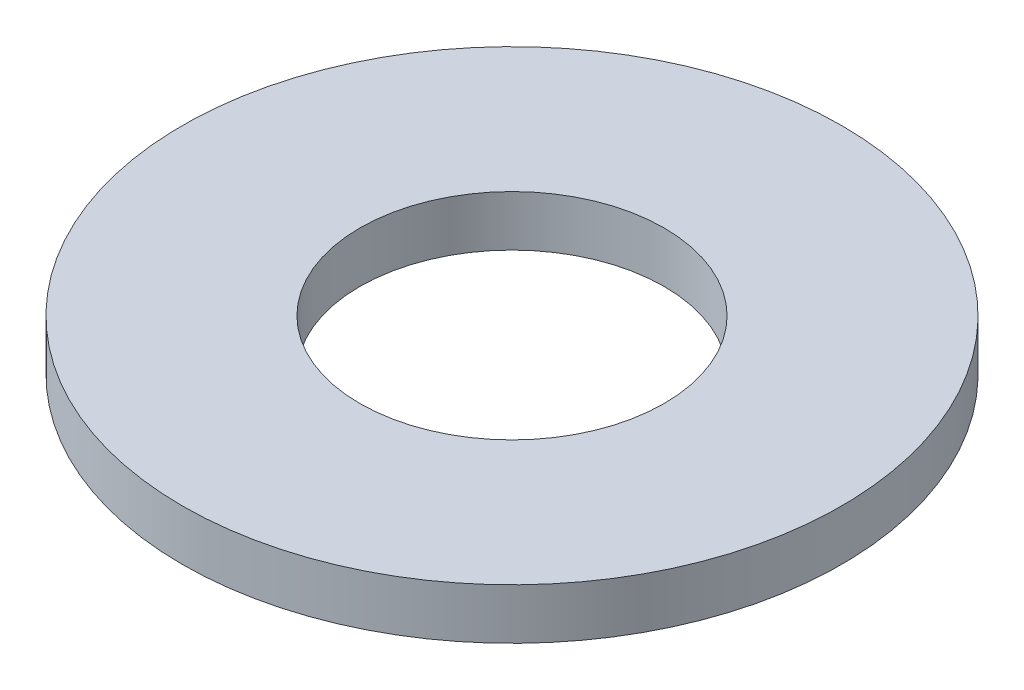
ISO-10303-21;
HEADER;
FILE_DESCRIPTION(('STEP AP214'),'2;1');
FILE_NAME('part.step','',(''),(''),'','','');
FILE_SCHEMA(('AUTOMOTIVE_DESIGN { 1 0 10303 214 1 1 1 1 }'));
ENDSEC;
DATA;
#1=APPLICATION_CONTEXT('core data for automotive mechanical design processes');
#2=APPLICATION_PROTOCOL_DEFINITION('international standard','automotive_design',2000,#1);
#3=PRODUCT_CONTEXT('',#1,'mechanical');
#4=PRODUCT('Part','Part','',(#3));
#5=PRODUCT_RELATED_PRODUCT_CATEGORY('part','',(#4));
#6=PRODUCT_DEFINITION_FORMATION('','',#4);
#7=PRODUCT_DEFINITION_CONTEXT('part definition',#1,'design');
#8=PRODUCT_DEFINITION('design','',#6,#7);
#9=PRODUCT_DEFINITION_SHAPE('','',#8);
#10=(LENGTH_UNIT() NAMED_UNIT(*) SI_UNIT(.MILLI.,.METRE.));
#11=(NAMED_UNIT(*) PLANE_ANGLE_UNIT() SI_UNIT($,.RADIAN.));
#12=(NAMED_UNIT(*) SI_UNIT($,.STERADIAN.) SOLID_ANGLE_UNIT());
#13=UNCERTAINTY_MEASURE_WITH_UNIT(LENGTH_MEASURE(1.E-05),#10,'distance_accuracy_value','');
#14=(GEOMETRIC_REPRESENTATION_CONTEXT(3) GLOBAL_UNCERTAINTY_ASSIGNED_CONTEXT((#13)) GLOBAL_UNIT_ASSIGNED_CONTEXT((#10,
#11,#12)) REPRESENTATION_CONTEXT('',''));
#15=CARTESIAN_POINT('',(0.,0.,0.));
#16=DIRECTION('',(0.,0.,1.));
#17=DIRECTION('',(1.,0.,0.));
#18=AXIS2_PLACEMENT_3D('',#15,#16,#17);
#19=CARTESIAN_POINT('',(0.,2.,0.));
#20=DIRECTION('',(0.,1.,0.));
#21=DIRECTION('',(0.,0.,1.));
#22=AXIS2_PLACEMENT_3D('',#19,#20,#21);
#23=PLANE('',#22);
#24=CARTESIAN_POINT('',(0.,2.,0.));
#25=DIRECTION('',(0.,1.,0.));
#26=DIRECTION('',(0.,0.,1.));
#27=AXIS2_PLACEMENT_3D('',#24,#25,#26);
#28=CIRCLE('',#27,13.);
#29=CARTESIAN_POINT('',(0.,2.,13.));
#30=VERTEX_POINT('',#29);
#31=EDGE_CURVE('E10',#30,#30,#28,.T.);
#32=ORIENTED_EDGE('',*,*,#31,.T.);
#33=EDGE_LOOP('',(#32));
#34=FACE_BOUND('',#33,.T.);
#35=CARTESIAN_POINT('',(0.,2.,0.));
#36=DIRECTION('',(0.,1.,0.));
#37=DIRECTION('',(0.,0.,1.));
#38=AXIS2_PLACEMENT_3D('',#35,#36,#37);
#39=CIRCLE('',#38,6.);
#40=CARTESIAN_POINT('',(0.,2.,6.));
#41=VERTEX_POINT('',#40);
#42=EDGE_CURVE('E56',#41,#41,#39,.T.);
#43=ORIENTED_EDGE('',*,*,#42,.F.);
#44=EDGE_LOOP('',(#43));
#45=FACE_BOUND('',#44,.T.);
#46=ADVANCED_FACE('F43',(#34,#45),#23,.T.);
#47=CARTESIAN_POINT('',(0.,0.,0.));
#48=DIRECTION('',(0.,1.,0.));
#49=DIRECTION('',(0.,0.,1.));
#50=AXIS2_PLACEMENT_3D('',#47,#48,#49);
#51=PLANE('',#50);
#52=CARTESIAN_POINT('',(0.,0.,0.));
#53=DIRECTION('',(0.,1.,0.));
#54=DIRECTION('',(0.,0.,1.));
#55=AXIS2_PLACEMENT_3D('',#52,#53,#54);
#56=CIRCLE('',#55,13.);
#57=CARTESIAN_POINT('',(0.,0.,13.));
#58=VERTEX_POINT('',#57);
#59=EDGE_CURVE('E47',#58,#58,#56,.T.);
#60=ORIENTED_EDGE('',*,*,#59,.F.);
#61=EDGE_LOOP('',(#60));
#62=FACE_BOUND('',#61,.T.);
#63=CARTESIAN_POINT('',(0.,0.,0.));
#64=DIRECTION('',(0.,1.,0.));
#65=DIRECTION('',(0.,0.,1.));
#66=AXIS2_PLACEMENT_3D('',#63,#64,#65);
#67=CIRCLE('',#66,6.);
#68=CARTESIAN_POINT('',(0.,0.,6.));
#69=VERTEX_POINT('',#68);
#70=EDGE_CURVE('E58',#69,#69,#67,.T.);
#71=ORIENTED_EDGE('',*,*,#70,.T.);
#72=EDGE_LOOP('',(#71));
#73=FACE_BOUND('',#72,.T.);
#74=ADVANCED_FACE('F70',(#62,#73),#51,.F.);
#75=CARTESIAN_POINT('',(0.,2.,0.));
#76=DIRECTION('',(0.,-1.,0.));
#77=DIRECTION('',(0.,0.,-1.));
#78=AXIS2_PLACEMENT_3D('',#75,#76,#77);
#79=CYLINDRICAL_SURFACE('',#78,13.);
#80=ORIENTED_EDGE('',*,*,#31,.F.);
#81=EDGE_LOOP('',(#80));
#82=FACE_BOUND('',#81,.T.);
#83=ORIENTED_EDGE('',*,*,#59,.T.);
#84=EDGE_LOOP('',(#83));
#85=FACE_BOUND('',#84,.T.);
#86=ADVANCED_FACE('F45',(#82,#85),#79,.T.);
#87=CARTESIAN_POINT('',(0.,2.,0.));
#88=DIRECTION('',(0.,-1.,0.));
#89=DIRECTION('',(0.,0.,-1.));
#90=AXIS2_PLACEMENT_3D('',#87,#88,#89);
#91=CYLINDRICAL_SURFACE('',#90,6.);
#92=ORIENTED_EDGE('',*,*,#42,.T.);
#93=EDGE_LOOP('',(#92));
#94=FACE_BOUND('',#93,.T.);
#95=ORIENTED_EDGE('',*,*,#70,.F.);
#96=EDGE_LOOP('',(#95));
#97=FACE_BOUND('',#96,.T.);
#98=ADVANCED_FACE('F66',(#94,#97),#91,.F.);
#99=CLOSED_SHELL('',(#46,#74,#86,#98));
#100=MANIFOLD_SOLID_BREP('B2',#99);
#101=ADVANCED_BREP_SHAPE_REPRESENTATION('',(#18,#100),#14);
#102=SHAPE_DEFINITION_REPRESENTATION(#9,#101);
ENDSEC;
END-ISO-10303-21;
